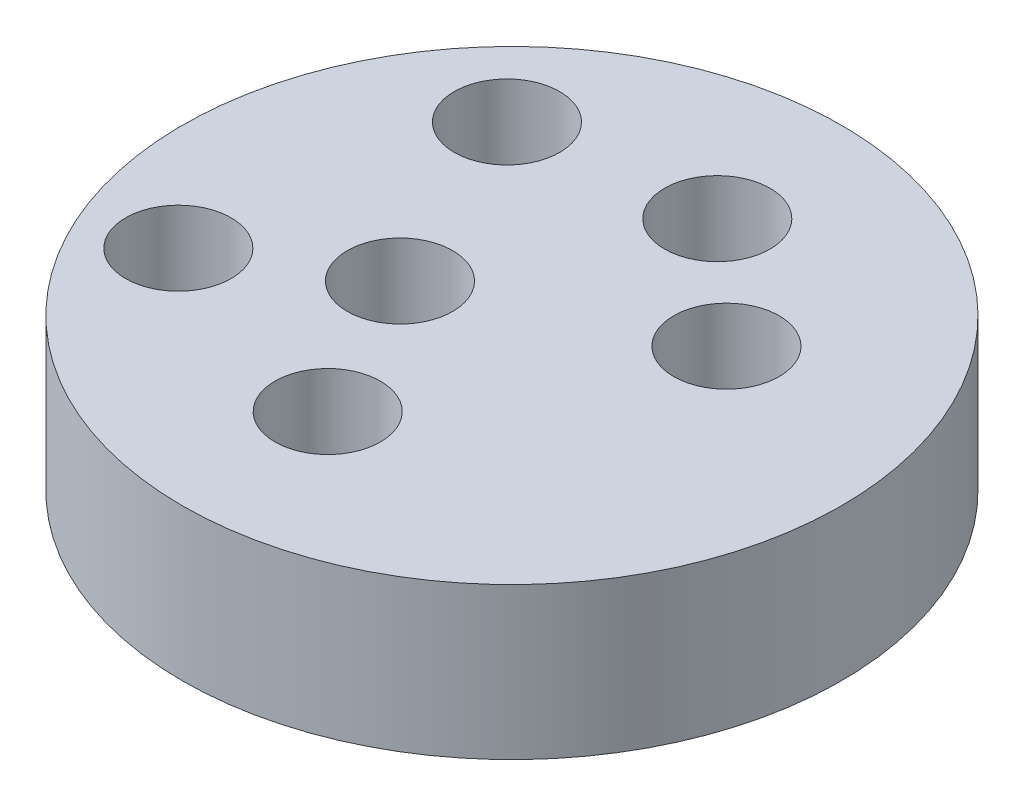
ISO-10303-21;
HEADER;
FILE_DESCRIPTION(('STEP AP214'),'2;1');
FILE_NAME('part.step','',(''),(''),'','','');
FILE_SCHEMA(('AUTOMOTIVE_DESIGN { 1 0 10303 214 1 1 1 1 }'));
ENDSEC;
DATA;
#1=APPLICATION_CONTEXT('core data for automotive mechanical design processes');
#2=APPLICATION_PROTOCOL_DEFINITION('international standard','automotive_design',2000,#1);
#3=PRODUCT_CONTEXT('',#1,'mechanical');
#4=PRODUCT('Part','Part','',(#3));
#5=PRODUCT_RELATED_PRODUCT_CATEGORY('part','',(#4));
#6=PRODUCT_DEFINITION_FORMATION('','',#4);
#7=PRODUCT_DEFINITION_CONTEXT('part definition',#1,'design');
#8=PRODUCT_DEFINITION('design','',#6,#7);
#9=PRODUCT_DEFINITION_SHAPE('','',#8);
#10=(LENGTH_UNIT() NAMED_UNIT(*) SI_UNIT(.MILLI.,.METRE.));
#11=(NAMED_UNIT(*) PLANE_ANGLE_UNIT() SI_UNIT($,.RADIAN.));
#12=(NAMED_UNIT(*) SI_UNIT($,.STERADIAN.) SOLID_ANGLE_UNIT());
#13=UNCERTAINTY_MEASURE_WITH_UNIT(LENGTH_MEASURE(1.E-05),#10,'distance_accuracy_value','');
#14=(GEOMETRIC_REPRESENTATION_CONTEXT(3) GLOBAL_UNCERTAINTY_ASSIGNED_CONTEXT((#13)) GLOBAL_UNIT_ASSIGNED_CONTEXT((#10,
#11,#12)) REPRESENTATION_CONTEXT('',''));
#15=CARTESIAN_POINT('',(0.,0.,0.));
#16=DIRECTION('',(0.,0.,1.));
#17=DIRECTION('',(1.,0.,0.));
#18=AXIS2_PLACEMENT_3D('',#15,#16,#17);
#19=CARTESIAN_POINT('',(0.,23.,0.));
#20=DIRECTION('',(0.,-1.,0.));
#21=DIRECTION('',(0.,0.,-1.));
#22=AXIS2_PLACEMENT_3D('',#19,#20,#21);
#23=CYLINDRICAL_SURFACE('',#22,50.);
#24=CARTESIAN_POINT('',(0.,23.,0.));
#25=DIRECTION('',(0.,1.,0.));
#26=DIRECTION('',(0.,0.,1.));
#27=AXIS2_PLACEMENT_3D('',#24,#25,#26);
#28=CIRCLE('',#27,50.);
#29=CARTESIAN_POINT('',(0.,23.,50.));
#30=VERTEX_POINT('',#29);
#31=EDGE_CURVE('E10',#30,#30,#28,.T.);
#32=ORIENTED_EDGE('',*,*,#31,.F.);
#33=EDGE_LOOP('',(#32));
#34=FACE_BOUND('',#33,.T.);
#35=CARTESIAN_POINT('',(0.,0.,0.));
#36=DIRECTION('',(0.,1.,0.));
#37=DIRECTION('',(0.,0.,1.));
#38=AXIS2_PLACEMENT_3D('',#35,#36,#37);
#39=CIRCLE('',#38,50.);
#40=CARTESIAN_POINT('',(0.,0.,50.));
#41=VERTEX_POINT('',#40);
#42=EDGE_CURVE('E34',#41,#41,#39,.T.);
#43=ORIENTED_EDGE('',*,*,#42,.T.);
#44=EDGE_LOOP('',(#43));
#45=FACE_BOUND('',#44,.T.);
#46=ADVANCED_FACE('F31',(#34,#45),#23,.T.);
#47=CARTESIAN_POINT('',(0.,23.,0.));
#48=DIRECTION('',(0.,1.,0.));
#49=DIRECTION('',(0.,0.,1.));
#50=AXIS2_PLACEMENT_3D('',#47,#48,#49);
#51=PLANE('',#50);
#52=CARTESIAN_POINT('',(-34.1473304308053,23.,16.460811011406));
#53=DIRECTION('',(0.,1.,0.));
#54=DIRECTION('',(0.,0.,1.));
#55=AXIS2_PLACEMENT_3D('',#52,#53,#54);
#56=CIRCLE('',#55,7.99999999999999);
#57=CARTESIAN_POINT('',(-34.1473304308053,23.,24.4608110114059));
#58=VERTEX_POINT('',#57);
#59=EDGE_CURVE('E75',#58,#58,#56,.T.);
#60=ORIENTED_EDGE('',*,*,#59,.F.);
#61=EDGE_LOOP('',(#60));
#62=FACE_BOUND('',#61,.T.);
#63=CARTESIAN_POINT('',(-25.8044862234144,23.,-25.0499498447283));
#64=DIRECTION('',(0.,1.,0.));
#65=DIRECTION('',(0.,0.,1.));
#66=AXIS2_PLACEMENT_3D('',#63,#64,#65);
#67=CIRCLE('',#66,7.99999999999999);
#68=CARTESIAN_POINT('',(-25.8044862234144,23.,-17.0499498447283));
#69=VERTEX_POINT('',#68);
#70=EDGE_CURVE('E69',#69,#69,#67,.T.);
#71=ORIENTED_EDGE('',*,*,#70,.F.);
#72=EDGE_LOOP('',(#71));
#73=FACE_BOUND('',#72,.T.);
#74=CARTESIAN_POINT('',(-1.35902726441373,23.,26.5936667983908));
#75=DIRECTION('',(0.,1.,0.));
#76=DIRECTION('',(0.,0.,1.));
#77=AXIS2_PLACEMENT_3D('',#74,#75,#76);
#78=CIRCLE('',#77,7.99999999999999);
#79=CARTESIAN_POINT('',(-1.35902726441373,23.,34.5936667983908));
#80=VERTEX_POINT('',#79);
#81=EDGE_CURVE('E63',#80,#80,#78,.T.);
#82=ORIENTED_EDGE('',*,*,#81,.F.);
#83=EDGE_LOOP('',(#82));
#84=FACE_BOUND('',#83,.T.);
#85=CARTESIAN_POINT('',(20.3004556154056,23.,-12.243339794459));
#86=DIRECTION('',(0.,1.,0.));
#87=DIRECTION('',(0.,0.,1.));
#88=AXIS2_PLACEMENT_3D('',#85,#86,#87);
#89=CIRCLE('',#88,7.99999999999999);
#90=CARTESIAN_POINT('',(20.3004556154056,23.,-4.24333979445903));
#91=VERTEX_POINT('',#90);
#92=EDGE_CURVE('E57',#91,#91,#89,.T.);
#93=ORIENTED_EDGE('',*,*,#92,.F.);
#94=EDGE_LOOP('',(#93));
#95=FACE_BOUND('',#94,.T.);
#96=CARTESIAN_POINT('',(-13.0223863150079,23.,3.9609765941151));
#97=DIRECTION('',(0.,1.,0.));
#98=DIRECTION('',(0.,0.,1.));
#99=AXIS2_PLACEMENT_3D('',#96,#97,#98);
#100=CIRCLE('',#99,7.99999999999999);
#101=CARTESIAN_POINT('',(-13.0223863150079,23.,11.9609765941151));
#102=VERTEX_POINT('',#101);
#103=EDGE_CURVE('E51',#102,#102,#100,.T.);
#104=ORIENTED_EDGE('',*,*,#103,.F.);
#105=EDGE_LOOP('',(#104));
#106=FACE_BOUND('',#105,.T.);
#107=CARTESIAN_POINT('',(2.85256702117209,23.,-28.3026012656435));
#108=DIRECTION('',(0.,1.,0.));
#109=DIRECTION('',(0.,0.,1.));
#110=AXIS2_PLACEMENT_3D('',#107,#108,#109);
#111=CIRCLE('',#110,7.99999999999999);
#112=CARTESIAN_POINT('',(2.85256702117209,23.,-20.3026012656436));
#113=VERTEX_POINT('',#112);
#114=EDGE_CURVE('E45',#113,#113,#111,.T.);
#115=ORIENTED_EDGE('',*,*,#114,.F.);
#116=EDGE_LOOP('',(#115));
#117=FACE_BOUND('',#116,.T.);
#118=ORIENTED_EDGE('',*,*,#31,.T.);
#119=EDGE_LOOP('',(#118));
#120=FACE_BOUND('',#119,.T.);
#121=ADVANCED_FACE('F81',(#62,#73,#84,#95,#106,#117,#120),#51,.T.);
#122=CARTESIAN_POINT('',(0.,0.,0.));
#123=DIRECTION('',(0.,1.,0.));
#124=DIRECTION('',(0.,0.,1.));
#125=AXIS2_PLACEMENT_3D('',#122,#123,#124);
#126=PLANE('',#125);
#127=CARTESIAN_POINT('',(-34.1473304308053,0.,16.460811011406));
#128=DIRECTION('',(0.,1.,0.));
#129=DIRECTION('',(0.,0.,1.));
#130=AXIS2_PLACEMENT_3D('',#127,#128,#129);
#131=CIRCLE('',#130,8.);
#132=CARTESIAN_POINT('',(-34.1473304308053,0.,24.4608110114059));
#133=VERTEX_POINT('',#132);
#134=EDGE_CURVE('E72',#133,#133,#131,.T.);
#135=ORIENTED_EDGE('',*,*,#134,.T.);
#136=EDGE_LOOP('',(#135));
#137=FACE_BOUND('',#136,.T.);
#138=CARTESIAN_POINT('',(-25.8044862234144,0.,-25.0499498447283));
#139=DIRECTION('',(0.,1.,0.));
#140=DIRECTION('',(0.,0.,1.));
#141=AXIS2_PLACEMENT_3D('',#138,#139,#140);
#142=CIRCLE('',#141,8.);
#143=CARTESIAN_POINT('',(-25.8044862234144,0.,-17.0499498447283));
#144=VERTEX_POINT('',#143);
#145=EDGE_CURVE('E66',#144,#144,#142,.T.);
#146=ORIENTED_EDGE('',*,*,#145,.T.);
#147=EDGE_LOOP('',(#146));
#148=FACE_BOUND('',#147,.T.);
#149=CARTESIAN_POINT('',(-1.35902726441373,0.,26.5936667983908));
#150=DIRECTION('',(0.,1.,0.));
#151=DIRECTION('',(0.,0.,1.));
#152=AXIS2_PLACEMENT_3D('',#149,#150,#151);
#153=CIRCLE('',#152,8.);
#154=CARTESIAN_POINT('',(-1.35902726441373,0.,34.5936667983908));
#155=VERTEX_POINT('',#154);
#156=EDGE_CURVE('E60',#155,#155,#153,.T.);
#157=ORIENTED_EDGE('',*,*,#156,.T.);
#158=EDGE_LOOP('',(#157));
#159=FACE_BOUND('',#158,.T.);
#160=CARTESIAN_POINT('',(20.3004556154056,0.,-12.243339794459));
#161=DIRECTION('',(0.,1.,0.));
#162=DIRECTION('',(0.,0.,1.));
#163=AXIS2_PLACEMENT_3D('',#160,#161,#162);
#164=CIRCLE('',#163,8.);
#165=CARTESIAN_POINT('',(20.3004556154056,0.,-4.24333979445902));
#166=VERTEX_POINT('',#165);
#167=EDGE_CURVE('E54',#166,#166,#164,.T.);
#168=ORIENTED_EDGE('',*,*,#167,.T.);
#169=EDGE_LOOP('',(#168));
#170=FACE_BOUND('',#169,.T.);
#171=CARTESIAN_POINT('',(-13.0223863150079,0.,3.9609765941151));
#172=DIRECTION('',(0.,1.,0.));
#173=DIRECTION('',(0.,0.,1.));
#174=AXIS2_PLACEMENT_3D('',#171,#172,#173);
#175=CIRCLE('',#174,8.);
#176=CARTESIAN_POINT('',(-13.0223863150079,0.,11.9609765941151));
#177=VERTEX_POINT('',#176);
#178=EDGE_CURVE('E48',#177,#177,#175,.T.);
#179=ORIENTED_EDGE('',*,*,#178,.T.);
#180=EDGE_LOOP('',(#179));
#181=FACE_BOUND('',#180,.T.);
#182=CARTESIAN_POINT('',(2.85256702117209,0.,-28.3026012656435));
#183=DIRECTION('',(0.,1.,0.));
#184=DIRECTION('',(0.,0.,1.));
#185=AXIS2_PLACEMENT_3D('',#182,#183,#184);
#186=CIRCLE('',#185,8.);
#187=CARTESIAN_POINT('',(2.85256702117209,0.,-20.3026012656435));
#188=VERTEX_POINT('',#187);
#189=EDGE_CURVE('E41',#188,#188,#186,.T.);
#190=ORIENTED_EDGE('',*,*,#189,.T.);
#191=EDGE_LOOP('',(#190));
#192=FACE_BOUND('',#191,.T.);
#193=ORIENTED_EDGE('',*,*,#42,.F.);
#194=EDGE_LOOP('',(#193));
#195=FACE_BOUND('',#194,.T.);
#196=ADVANCED_FACE('F84',(#137,#148,#159,#170,#181,#192,#195),#126,.F.);
#197=CARTESIAN_POINT('',(2.85256702117209,23.,-28.3026012656435));
#198=DIRECTION('',(0.,1.,0.));
#199=DIRECTION('',(0.,0.,1.));
#200=AXIS2_PLACEMENT_3D('',#197,#198,#199);
#201=CYLINDRICAL_SURFACE('',#200,7.99999999999999);
#202=ORIENTED_EDGE('',*,*,#189,.F.);
#203=EDGE_LOOP('',(#202));
#204=FACE_BOUND('',#203,.T.);
#205=ORIENTED_EDGE('',*,*,#114,.T.);
#206=EDGE_LOOP('',(#205));
#207=FACE_BOUND('',#206,.T.);
#208=ADVANCED_FACE('F96',(#204,#207),#201,.F.);
#209=CARTESIAN_POINT('',(-13.0223863150079,23.,3.9609765941151));
#210=DIRECTION('',(0.,1.,0.));
#211=DIRECTION('',(0.,0.,1.));
#212=AXIS2_PLACEMENT_3D('',#209,#210,#211);
#213=CYLINDRICAL_SURFACE('',#212,7.99999999999999);
#214=ORIENTED_EDGE('',*,*,#178,.F.);
#215=EDGE_LOOP('',(#214));
#216=FACE_BOUND('',#215,.T.);
#217=ORIENTED_EDGE('',*,*,#103,.T.);
#218=EDGE_LOOP('',(#217));
#219=FACE_BOUND('',#218,.T.);
#220=ADVANCED_FACE('F98',(#216,#219),#213,.F.);
#221=CARTESIAN_POINT('',(20.3004556154056,23.,-12.243339794459));
#222=DIRECTION('',(0.,1.,0.));
#223=DIRECTION('',(0.,0.,1.));
#224=AXIS2_PLACEMENT_3D('',#221,#222,#223);
#225=CYLINDRICAL_SURFACE('',#224,7.99999999999999);
#226=ORIENTED_EDGE('',*,*,#167,.F.);
#227=EDGE_LOOP('',(#226));
#228=FACE_BOUND('',#227,.T.);
#229=ORIENTED_EDGE('',*,*,#92,.T.);
#230=EDGE_LOOP('',(#229));
#231=FACE_BOUND('',#230,.T.);
#232=ADVANCED_FACE('F105',(#228,#231),#225,.F.);
#233=CARTESIAN_POINT('',(-1.35902726441373,23.,26.5936667983908));
#234=DIRECTION('',(0.,1.,0.));
#235=DIRECTION('',(0.,0.,1.));
#236=AXIS2_PLACEMENT_3D('',#233,#234,#235);
#237=CYLINDRICAL_SURFACE('',#236,7.99999999999999);
#238=ORIENTED_EDGE('',*,*,#156,.F.);
#239=EDGE_LOOP('',(#238));
#240=FACE_BOUND('',#239,.T.);
#241=ORIENTED_EDGE('',*,*,#81,.T.);
#242=EDGE_LOOP('',(#241));
#243=FACE_BOUND('',#242,.T.);
#244=ADVANCED_FACE('F144',(#240,#243),#237,.F.);
#245=CARTESIAN_POINT('',(-25.8044862234144,23.,-25.0499498447283));
#246=DIRECTION('',(0.,1.,0.));
#247=DIRECTION('',(0.,0.,1.));
#248=AXIS2_PLACEMENT_3D('',#245,#246,#247);
#249=CYLINDRICAL_SURFACE('',#248,7.99999999999999);
#250=ORIENTED_EDGE('',*,*,#145,.F.);
#251=EDGE_LOOP('',(#250));
#252=FACE_BOUND('',#251,.T.);
#253=ORIENTED_EDGE('',*,*,#70,.T.);
#254=EDGE_LOOP('',(#253));
#255=FACE_BOUND('',#254,.T.);
#256=ADVANCED_FACE('F154',(#252,#255),#249,.F.);
#257=CARTESIAN_POINT('',(-34.1473304308053,23.,16.460811011406));
#258=DIRECTION('',(0.,1.,0.));
#259=DIRECTION('',(0.,0.,1.));
#260=AXIS2_PLACEMENT_3D('',#257,#258,#259);
#261=CYLINDRICAL_SURFACE('',#260,7.99999999999999);
#262=ORIENTED_EDGE('',*,*,#134,.F.);
#263=EDGE_LOOP('',(#262));
#264=FACE_BOUND('',#263,.T.);
#265=ORIENTED_EDGE('',*,*,#59,.T.);
#266=EDGE_LOOP('',(#265));
#267=FACE_BOUND('',#266,.T.);
#268=ADVANCED_FACE('F79',(#264,#267),#261,.F.);
#269=CLOSED_SHELL('',(#46,#121,#196,#208,#220,#232,#244,#256,#268));
#270=MANIFOLD_SOLID_BREP('B2',#269);
#271=ADVANCED_BREP_SHAPE_REPRESENTATION('',(#18,#270),#14);
#272=SHAPE_DEFINITION_REPRESENTATION(#9,#271);
ENDSEC;
END-ISO-10303-21;
